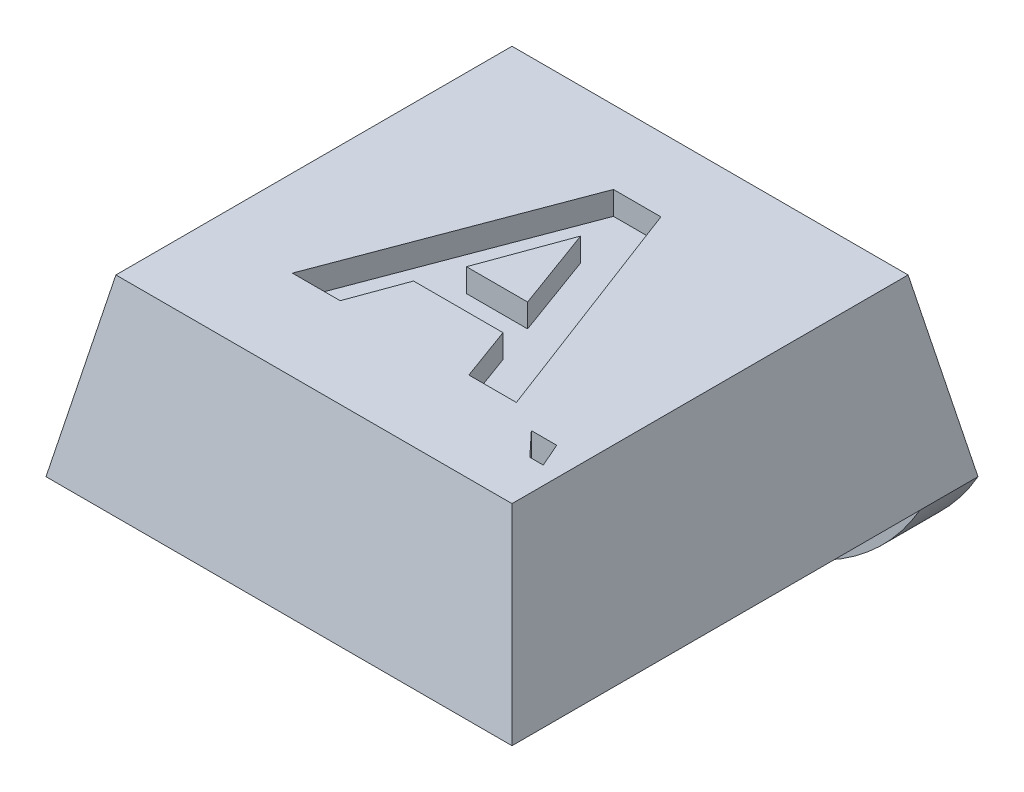
ISO-10303-21;
HEADER;
FILE_DESCRIPTION(('STEP AP214'),'2;1');
FILE_NAME('part.step','',(''),(''),'','','');
FILE_SCHEMA(('AUTOMOTIVE_DESIGN { 1 0 10303 214 1 1 1 1 }'));
ENDSEC;
DATA;
#1=APPLICATION_CONTEXT('core data for automotive mechanical design processes');
#2=APPLICATION_PROTOCOL_DEFINITION('international standard','automotive_design',2000,#1);
#3=PRODUCT_CONTEXT('',#1,'mechanical');
#4=PRODUCT('Part','Part','',(#3));
#5=PRODUCT_RELATED_PRODUCT_CATEGORY('part','',(#4));
#6=PRODUCT_DEFINITION_FORMATION('','',#4);
#7=PRODUCT_DEFINITION_CONTEXT('part definition',#1,'design');
#8=PRODUCT_DEFINITION('design','',#6,#7);
#9=PRODUCT_DEFINITION_SHAPE('','',#8);
#10=(LENGTH_UNIT() NAMED_UNIT(*) SI_UNIT(.MILLI.,.METRE.));
#11=(NAMED_UNIT(*) PLANE_ANGLE_UNIT() SI_UNIT($,.RADIAN.));
#12=(NAMED_UNIT(*) SI_UNIT($,.STERADIAN.) SOLID_ANGLE_UNIT());
#13=UNCERTAINTY_MEASURE_WITH_UNIT(LENGTH_MEASURE(1.E-05),#10,'distance_accuracy_value','');
#14=(GEOMETRIC_REPRESENTATION_CONTEXT(3) GLOBAL_UNCERTAINTY_ASSIGNED_CONTEXT((#13)) GLOBAL_UNIT_ASSIGNED_CONTEXT((#10,
#11,#12)) REPRESENTATION_CONTEXT('',''));
#15=CARTESIAN_POINT('',(0.,0.,0.));
#16=DIRECTION('',(0.,0.,1.));
#17=DIRECTION('',(1.,0.,0.));
#18=AXIS2_PLACEMENT_3D('',#15,#16,#17);
#19=CARTESIAN_POINT('',(0.,3.,0.));
#20=DIRECTION('',(0.,-1.,0.));
#21=DIRECTION('',(0.,0.,-1.));
#22=AXIS2_PLACEMENT_3D('',#19,#20,#21);
#23=PLANE('',#22);
#24=DIRECTION('',(0.355060662326772,0.,0.934843262835045));
#25=VECTOR('',#24,1.);
#26=CARTESIAN_POINT('',(4.41462653323797,3.,-6.14165206843505));
#27=LINE('',#26,#25);
#28=CARTESIAN_POINT('',(4.41462653323797,3.,-6.14165206843505));
#29=VERTEX_POINT('',#28);
#30=CARTESIAN_POINT('',(5.93385730246874,3.,-2.14165206843505));
#31=VERTEX_POINT('',#30);
#32=EDGE_CURVE('E67',#29,#31,#27,.T.);
#33=ORIENTED_EDGE('',*,*,#32,.T.);
#34=DIRECTION('',(-1.,0.,0.));
#35=VECTOR('',#34,1.);
#36=CARTESIAN_POINT('',(5.93385730246874,3.,-2.14165206843505));
#37=LINE('',#36,#35);
#38=CARTESIAN_POINT('',(5.11815217426361,3.,-2.14165206843505));
#39=VERTEX_POINT('',#38);
#40=EDGE_CURVE('E287',#31,#39,#37,.T.);
#41=ORIENTED_EDGE('',*,*,#40,.T.);
#42=DIRECTION('',(-0.343248282132193,0.,-0.939244705501872));
#43=VECTOR('',#42,1.);
#44=CARTESIAN_POINT('',(5.11815217426361,3.,-2.14165206843505));
#45=LINE('',#44,#43);
#46=CARTESIAN_POINT('',(4.78081243067387,3.,-3.06472899151198));
#47=VERTEX_POINT('',#46);
#48=EDGE_CURVE('E291',#39,#47,#45,.T.);
#49=ORIENTED_EDGE('',*,*,#48,.T.);
#50=DIRECTION('',(-1.,0.,0.));
#51=VECTOR('',#50,1.);
#52=CARTESIAN_POINT('',(4.78081243067387,3.,-3.06472899151198));
#53=LINE('',#52,#51);
#54=CARTESIAN_POINT('',(3.24555602041746,3.,-3.06472899151198));
#55=VERTEX_POINT('',#54);
#56=EDGE_CURVE('E295',#47,#55,#53,.T.);
#57=ORIENTED_EDGE('',*,*,#56,.T.);
#58=DIRECTION('',(-0.343248282132194,0.,0.939244705501872));
#59=VECTOR('',#58,1.);
#60=CARTESIAN_POINT('',(3.24555602041746,3.,-3.06472899151198));
#61=LINE('',#60,#59);
#62=CARTESIAN_POINT('',(2.90821627682771,3.,-2.14165206843505));
#63=VERTEX_POINT('',#62);
#64=EDGE_CURVE('E299',#55,#63,#61,.T.);
#65=ORIENTED_EDGE('',*,*,#64,.T.);
#66=DIRECTION('',(-1.,0.,0.));
#67=VECTOR('',#66,1.);
#68=CARTESIAN_POINT('',(2.90821627682771,3.,-2.14165206843505));
#69=LINE('',#68,#67);
#70=CARTESIAN_POINT('',(2.08770345631489,3.,-2.14165206843505));
#71=VERTEX_POINT('',#70);
#72=EDGE_CURVE('E303',#63,#71,#69,.T.);
#73=ORIENTED_EDGE('',*,*,#72,.T.);
#74=DIRECTION('',(0.353586403368764,0.,-0.935401868371419));
#75=VECTOR('',#74,1.);
#76=CARTESIAN_POINT('',(2.08770345631489,3.,-2.14165206843505));
#77=LINE('',#76,#75);
#78=CARTESIAN_POINT('',(3.59972268708412,3.,-6.14165206843505));
#79=VERTEX_POINT('',#78);
#80=EDGE_CURVE('E307',#71,#79,#77,.T.);
#81=ORIENTED_EDGE('',*,*,#80,.T.);
#82=DIRECTION('',(1.,0.,0.));
#83=VECTOR('',#82,1.);
#84=CARTESIAN_POINT('',(3.59972268708412,3.,-6.14165206843505));
#85=LINE('',#84,#83);
#86=EDGE_CURVE('E263',#79,#29,#85,.T.);
#87=ORIENTED_EDGE('',*,*,#86,.T.);
#88=EDGE_LOOP('',(#33,#41,#49,#57,#65,#73,#81,#87));
#89=FACE_BOUND('',#88,.T.);
#90=DIRECTION('',(-1.,0.,0.));
#91=VECTOR('',#90,1.);
#92=CARTESIAN_POINT('',(11.,3.,-0.6));
#93=LINE('',#92,#91);
#94=CARTESIAN_POINT('',(7.4,3.,-0.6));
#95=VERTEX_POINT('',#94);
#96=CARTESIAN_POINT('',(0.6,3.,-0.6));
#97=VERTEX_POINT('',#96);
#98=EDGE_CURVE('E362',#95,#97,#93,.T.);
#99=ORIENTED_EDGE('',*,*,#98,.F.);
#100=DIRECTION('',(0.,0.,1.));
#101=VECTOR('',#100,1.);
#102=CARTESIAN_POINT('',(7.4,3.,-8.));
#103=LINE('',#102,#101);
#104=CARTESIAN_POINT('',(7.4,3.,-7.4));
#105=VERTEX_POINT('',#104);
#106=EDGE_CURVE('E375',#105,#95,#103,.T.);
#107=ORIENTED_EDGE('',*,*,#106,.F.);
#108=DIRECTION('',(-1.,0.,0.));
#109=VECTOR('',#108,1.);
#110=CARTESIAN_POINT('',(11.,3.,-7.4));
#111=LINE('',#110,#109);
#112=CARTESIAN_POINT('',(0.599999999999999,3.,-7.4));
#113=VERTEX_POINT('',#112);
#114=EDGE_CURVE('E358',#105,#113,#111,.T.);
#115=ORIENTED_EDGE('',*,*,#114,.T.);
#116=DIRECTION('',(0.,0.,1.));
#117=VECTOR('',#116,1.);
#118=CARTESIAN_POINT('',(0.6,3.,-8.));
#119=LINE('',#118,#117);
#120=EDGE_CURVE('E378',#113,#97,#119,.T.);
#121=ORIENTED_EDGE('',*,*,#120,.T.);
#122=EDGE_LOOP('',(#99,#107,#115,#121));
#123=FACE_BOUND('',#122,.T.);
#124=DIRECTION('',(0.400818834019709,0.,0.916157334902188));
#125=VECTOR('',#124,1.);
#126=CARTESIAN_POINT('',(6.91610453258598,3.,-1.85152273990893));
#127=LINE('',#126,#125);
#128=CARTESIAN_POINT('',(6.91610453258598,3.,-1.85152273990893));
#129=VERTEX_POINT('',#128);
#130=CARTESIAN_POINT('',(7.09559171207316,3.,-1.44126632965252));
#131=VERTEX_POINT('',#130);
#132=EDGE_CURVE('E59',#129,#131,#127,.T.);
#133=ORIENTED_EDGE('',*,*,#132,.T.);
#134=DIRECTION('',(-1.,0.,0.));
#135=VECTOR('',#134,1.);
#136=CARTESIAN_POINT('',(7.09559171207316,3.,-1.44126632965252));
#137=LINE('',#136,#135);
#138=CARTESIAN_POINT('',(6.86482248130392,3.,-1.44126632965252));
#139=VERTEX_POINT('',#138);
#140=EDGE_CURVE('E215',#131,#139,#137,.T.);
#141=ORIENTED_EDGE('',*,*,#140,.T.);
#142=DIRECTION('',(-0.68394112888133,0.,-0.729537204140085));
#143=VECTOR('',#142,1.);
#144=CARTESIAN_POINT('',(6.86482248130392,3.,-1.44126632965252));
#145=LINE('',#144,#143);
#146=CARTESIAN_POINT('',(6.48020709668854,3.,-1.85152273990893));
#147=VERTEX_POINT('',#146);
#148=EDGE_CURVE('E482',#139,#147,#145,.T.);
#149=ORIENTED_EDGE('',*,*,#148,.T.);
#150=DIRECTION('',(1.,0.,0.));
#151=VECTOR('',#150,1.);
#152=CARTESIAN_POINT('',(6.48020709668854,3.,-1.85152273990893));
#153=LINE('',#152,#151);
#154=EDGE_CURVE('E211',#147,#129,#153,.T.);
#155=ORIENTED_EDGE('',*,*,#154,.T.);
#156=EDGE_LOOP('',(#133,#141,#149,#155));
#157=FACE_BOUND('',#156,.T.);
#158=ADVANCED_FACE('F43',(#89,#123,#157),#23,.F.);
#159=CARTESIAN_POINT('',(8.,0.,-8.));
#160=DIRECTION('',(-0.98058067569092,-0.196116135138184,0.));
#161=DIRECTION('',(0.196116135138184,-0.98058067569092,0.));
#162=AXIS2_PLACEMENT_3D('',#159,#160,#161);
#163=PLANE('',#162);
#164=DIRECTION('',(-0.192450089729875,0.962250448649376,-0.192450089729875));
#165=VECTOR('',#164,1.);
#166=CARTESIAN_POINT('',(7.7037037037037,1.48148148148148,-0.296296296296296));
#167=LINE('',#166,#165);
#168=CARTESIAN_POINT('',(8.,0.,0.));
#169=VERTEX_POINT('',#168);
#170=EDGE_CURVE('E372',#169,#95,#167,.T.);
#171=ORIENTED_EDGE('',*,*,#170,.F.);
#172=DIRECTION('',(0.,0.,-1.));
#173=VECTOR('',#172,1.);
#174=CARTESIAN_POINT('',(8.,0.,0.));
#175=LINE('',#174,#173);
#176=CARTESIAN_POINT('',(8.,0.,-7.));
#177=VERTEX_POINT('',#176);
#178=EDGE_CURVE('E391',#169,#177,#175,.T.);
#179=ORIENTED_EDGE('',*,*,#178,.T.);
#180=DIRECTION('',(0.,0.,1.));
#181=VECTOR('',#180,1.);
#182=CARTESIAN_POINT('',(8.,0.,-8.));
#183=LINE('',#182,#181);
#184=CARTESIAN_POINT('',(8.,0.,-8.));
#185=VERTEX_POINT('',#184);
#186=EDGE_CURVE('E337',#185,#177,#183,.T.);
#187=ORIENTED_EDGE('',*,*,#186,.F.);
#188=DIRECTION('',(0.192450089729875,-0.962250448649376,-0.192450089729875));
#189=VECTOR('',#188,1.);
#190=CARTESIAN_POINT('',(8.,0.,-8.));
#191=LINE('',#190,#189);
#192=EDGE_CURVE('E365',#105,#185,#191,.T.);
#193=ORIENTED_EDGE('',*,*,#192,.F.);
#194=ORIENTED_EDGE('',*,*,#106,.T.);
#195=EDGE_LOOP('',(#171,#179,#187,#193,#194));
#196=FACE_BOUND('',#195,.T.);
#197=ADVANCED_FACE('F464',(#196),#163,.F.);
#198=CARTESIAN_POINT('',(0.,0.,-8.));
#199=DIRECTION('',(0.98058067569092,-0.196116135138184,0.));
#200=DIRECTION('',(0.196116135138184,0.98058067569092,0.));
#201=AXIS2_PLACEMENT_3D('',#198,#199,#200);
#202=PLANE('',#201);
#203=DIRECTION('',(-0.192450089729875,-0.962250448649376,0.192450089729875));
#204=VECTOR('',#203,1.);
#205=CARTESIAN_POINT('',(0.296296296296296,1.48148148148148,-0.296296296296296));
#206=LINE('',#205,#204);
#207=CARTESIAN_POINT('',(0.,0.,0.));
#208=VERTEX_POINT('',#207);
#209=EDGE_CURVE('E419',#97,#208,#206,.T.);
#210=ORIENTED_EDGE('',*,*,#209,.F.);
#211=ORIENTED_EDGE('',*,*,#120,.F.);
#212=DIRECTION('',(0.192450089729875,0.962250448649376,0.192450089729875));
#213=VECTOR('',#212,1.);
#214=CARTESIAN_POINT('',(0.,0.,-8.));
#215=LINE('',#214,#213);
#216=CARTESIAN_POINT('',(0.,0.,-8.));
#217=VERTEX_POINT('',#216);
#218=EDGE_CURVE('E390',#217,#113,#215,.T.);
#219=ORIENTED_EDGE('',*,*,#218,.F.);
#220=DIRECTION('',(0.,0.,1.));
#221=VECTOR('',#220,1.);
#222=CARTESIAN_POINT('',(0.,0.,0.));
#223=LINE('',#222,#221);
#224=CARTESIAN_POINT('',(0.,0.,-7.));
#225=VERTEX_POINT('',#224);
#226=EDGE_CURVE('E395',#217,#225,#223,.T.);
#227=ORIENTED_EDGE('',*,*,#226,.T.);
#228=EDGE_CURVE('E382',#225,#208,#223,.T.);
#229=ORIENTED_EDGE('',*,*,#228,.T.);
#230=EDGE_LOOP('',(#210,#211,#219,#227,#229));
#231=FACE_BOUND('',#230,.T.);
#232=ADVANCED_FACE('F444',(#231),#202,.F.);
#233=CARTESIAN_POINT('',(0.,0.,0.));
#234=DIRECTION('',(0.,-1.,0.));
#235=DIRECTION('',(0.,0.,-1.));
#236=AXIS2_PLACEMENT_3D('',#233,#234,#235);
#237=PLANE('',#236);
#238=DIRECTION('',(-1.,0.,0.));
#239=VECTOR('',#238,1.);
#240=CARTESIAN_POINT('',(0.,0.,-7.));
#241=LINE('',#240,#239);
#242=EDGE_CURVE('E343',#177,#225,#241,.T.);
#243=ORIENTED_EDGE('',*,*,#242,.F.);
#244=ORIENTED_EDGE('',*,*,#178,.F.);
#245=DIRECTION('',(1.,0.,0.));
#246=VECTOR('',#245,1.);
#247=CARTESIAN_POINT('',(0.,0.,0.));
#248=LINE('',#247,#246);
#249=EDGE_CURVE('E392',#208,#169,#248,.T.);
#250=ORIENTED_EDGE('',*,*,#249,.F.);
#251=ORIENTED_EDGE('',*,*,#228,.F.);
#252=EDGE_LOOP('',(#243,#244,#250,#251));
#253=FACE_BOUND('',#252,.T.);
#254=CARTESIAN_POINT('',(4.,0.,-3.75));
#255=DIRECTION('',(0.,-1.,0.));
#256=DIRECTION('',(0.,0.,-1.));
#257=AXIS2_PLACEMENT_3D('',#254,#255,#256);
#258=CIRCLE('',#257,1.75);
#259=CARTESIAN_POINT('',(4.,0.,-5.5));
#260=VERTEX_POINT('',#259);
#261=EDGE_CURVE('E347',#260,#260,#258,.T.);
#262=ORIENTED_EDGE('',*,*,#261,.F.);
#263=EDGE_LOOP('',(#262));
#264=FACE_BOUND('',#263,.T.);
#265=ADVANCED_FACE('F459',(#253,#264),#237,.T.);
#266=CARTESIAN_POINT('',(11.,3.,-7.4));
#267=DIRECTION('',(0.,0.196116135138184,-0.98058067569092));
#268=DIRECTION('',(0.,0.98058067569092,0.196116135138184));
#269=AXIS2_PLACEMENT_3D('',#266,#267,#268);
#270=PLANE('',#269);
#271=ORIENTED_EDGE('',*,*,#192,.T.);
#272=DIRECTION('',(-1.,0.,0.));
#273=VECTOR('',#272,1.);
#274=CARTESIAN_POINT('',(0.,0.,-8.));
#275=LINE('',#274,#273);
#276=EDGE_CURVE('E386',#185,#217,#275,.T.);
#277=ORIENTED_EDGE('',*,*,#276,.T.);
#278=ORIENTED_EDGE('',*,*,#218,.T.);
#279=ORIENTED_EDGE('',*,*,#114,.F.);
#280=EDGE_LOOP('',(#271,#277,#278,#279));
#281=FACE_BOUND('',#280,.T.);
#282=ADVANCED_FACE('F439',(#281),#270,.T.);
#283=CARTESIAN_POINT('',(11.,0.,0.));
#284=DIRECTION('',(0.,0.196116135138184,0.98058067569092));
#285=DIRECTION('',(0.,-0.98058067569092,0.196116135138184));
#286=AXIS2_PLACEMENT_3D('',#283,#284,#285);
#287=PLANE('',#286);
#288=ORIENTED_EDGE('',*,*,#170,.T.);
#289=ORIENTED_EDGE('',*,*,#98,.T.);
#290=ORIENTED_EDGE('',*,*,#209,.T.);
#291=ORIENTED_EDGE('',*,*,#249,.T.);
#292=EDGE_LOOP('',(#288,#289,#290,#291));
#293=FACE_BOUND('',#292,.T.);
#294=ADVANCED_FACE('F468',(#293),#287,.T.);
#295=CARTESIAN_POINT('',(4.,0.4,-3.75));
#296=DIRECTION('',(0.,-1.,0.));
#297=DIRECTION('',(0.,0.,-1.));
#298=AXIS2_PLACEMENT_3D('',#295,#296,#297);
#299=CYLINDRICAL_SURFACE('',#298,1.75);
#300=CARTESIAN_POINT('',(4.,0.4,-3.75));
#301=DIRECTION('',(0.,-1.,0.));
#302=DIRECTION('',(0.,0.,-1.));
#303=AXIS2_PLACEMENT_3D('',#300,#301,#302);
#304=CIRCLE('',#303,1.75);
#305=CARTESIAN_POINT('',(4.,0.4,-5.5));
#306=VERTEX_POINT('',#305);
#307=EDGE_CURVE('E354',#306,#306,#304,.T.);
#308=ORIENTED_EDGE('',*,*,#307,.F.);
#309=EDGE_LOOP('',(#308));
#310=FACE_BOUND('',#309,.T.);
#311=ORIENTED_EDGE('',*,*,#261,.T.);
#312=EDGE_LOOP('',(#311));
#313=FACE_BOUND('',#312,.T.);
#314=ADVANCED_FACE('F571',(#310,#313),#299,.F.);
#315=CARTESIAN_POINT('',(4.,0.4,-3.75));
#316=DIRECTION('',(0.,-1.,0.));
#317=DIRECTION('',(0.,0.,-1.));
#318=AXIS2_PLACEMENT_3D('',#315,#316,#317);
#319=PLANE('',#318);
#320=ORIENTED_EDGE('',*,*,#307,.T.);
#321=EDGE_LOOP('',(#320));
#322=FACE_BOUND('',#321,.T.);
#323=ADVANCED_FACE('F568',(#322),#319,.T.);
#324=CARTESIAN_POINT('',(0.,-2.,-8.));
#325=DIRECTION('',(0.,0.,1.));
#326=DIRECTION('',(1.,0.,0.));
#327=AXIS2_PLACEMENT_3D('',#324,#325,#326);
#328=PLANE('',#327);
#329=ORIENTED_EDGE('',*,*,#276,.F.);
#330=CARTESIAN_POINT('',(4.53589838486225,2.,-8.));
#331=DIRECTION('',(0.,0.,1.));
#332=DIRECTION('',(1.,0.,0.));
#333=AXIS2_PLACEMENT_3D('',#330,#331,#332);
#334=CIRCLE('',#333,4.);
#335=CARTESIAN_POINT('',(4.53589838486225,-2.,-8.));
#336=VERTEX_POINT('',#335);
#337=EDGE_CURVE('E11',#185,#336,#334,.F.);
#338=ORIENTED_EDGE('',*,*,#337,.T.);
#339=DIRECTION('',(1.,0.,0.));
#340=VECTOR('',#339,1.);
#341=CARTESIAN_POINT('',(0.,-2.,-8.));
#342=LINE('',#341,#340);
#343=CARTESIAN_POINT('',(3.46410161513775,-2.,-8.));
#344=VERTEX_POINT('',#343);
#345=EDGE_CURVE('E338',#344,#336,#342,.T.);
#346=ORIENTED_EDGE('',*,*,#345,.F.);
#347=CARTESIAN_POINT('',(3.46410161513775,2.,-8.));
#348=DIRECTION('',(0.,0.,1.));
#349=DIRECTION('',(1.,0.,0.));
#350=AXIS2_PLACEMENT_3D('',#347,#348,#349);
#351=CIRCLE('',#350,4.);
#352=EDGE_CURVE('E52',#344,#217,#351,.F.);
#353=ORIENTED_EDGE('',*,*,#352,.T.);
#354=EDGE_LOOP('',(#329,#338,#346,#353));
#355=FACE_BOUND('',#354,.T.);
#356=ADVANCED_FACE('F432',(#355),#328,.F.);
#357=CARTESIAN_POINT('',(0.,-2.,-7.));
#358=DIRECTION('',(0.,0.,-1.));
#359=DIRECTION('',(-1.,0.,0.));
#360=AXIS2_PLACEMENT_3D('',#357,#358,#359);
#361=PLANE('',#360);
#362=DIRECTION('',(-1.,0.,0.));
#363=VECTOR('',#362,1.);
#364=CARTESIAN_POINT('',(0.,-2.,-7.));
#365=LINE('',#364,#363);
#366=CARTESIAN_POINT('',(4.53589838486225,-2.,-7.));
#367=VERTEX_POINT('',#366);
#368=CARTESIAN_POINT('',(3.46410161513775,-2.,-7.));
#369=VERTEX_POINT('',#368);
#370=EDGE_CURVE('E342',#367,#369,#365,.T.);
#371=ORIENTED_EDGE('',*,*,#370,.F.);
#372=CARTESIAN_POINT('',(4.53589838486225,2.,-7.));
#373=DIRECTION('',(0.,0.,-1.));
#374=DIRECTION('',(-1.,0.,0.));
#375=AXIS2_PLACEMENT_3D('',#372,#373,#374);
#376=CIRCLE('',#375,4.);
#377=EDGE_CURVE('E426',#367,#177,#376,.F.);
#378=ORIENTED_EDGE('',*,*,#377,.T.);
#379=ORIENTED_EDGE('',*,*,#242,.T.);
#380=CARTESIAN_POINT('',(3.46410161513775,2.,-7.));
#381=DIRECTION('',(0.,0.,-1.));
#382=DIRECTION('',(-1.,0.,0.));
#383=AXIS2_PLACEMENT_3D('',#380,#381,#382);
#384=CIRCLE('',#383,4.);
#385=EDGE_CURVE('E423',#225,#369,#384,.F.);
#386=ORIENTED_EDGE('',*,*,#385,.T.);
#387=EDGE_LOOP('',(#371,#378,#379,#386));
#388=FACE_BOUND('',#387,.T.);
#389=ADVANCED_FACE('F450',(#388),#361,.F.);
#390=CARTESIAN_POINT('',(0.,-2.,0.));
#391=DIRECTION('',(0.,1.,0.));
#392=DIRECTION('',(0.,0.,1.));
#393=AXIS2_PLACEMENT_3D('',#390,#391,#392);
#394=PLANE('',#393);
#395=ORIENTED_EDGE('',*,*,#345,.T.);
#396=DIRECTION('',(0.,0.,1.));
#397=VECTOR('',#396,1.);
#398=CARTESIAN_POINT('',(4.53589838486225,-2.,0.));
#399=LINE('',#398,#397);
#400=EDGE_CURVE('E418',#336,#367,#399,.T.);
#401=ORIENTED_EDGE('',*,*,#400,.T.);
#402=ORIENTED_EDGE('',*,*,#370,.T.);
#403=DIRECTION('',(0.,0.,-1.));
#404=VECTOR('',#403,1.);
#405=CARTESIAN_POINT('',(3.46410161513775,-2.,0.));
#406=LINE('',#405,#404);
#407=EDGE_CURVE('E414',#369,#344,#406,.T.);
#408=ORIENTED_EDGE('',*,*,#407,.T.);
#409=EDGE_LOOP('',(#395,#401,#402,#408));
#410=FACE_BOUND('',#409,.T.);
#411=ADVANCED_FACE('F453',(#410),#394,.F.);
#412=CARTESIAN_POINT('',(4.53589838486225,2.,-8.));
#413=DIRECTION('',(0.,0.,1.));
#414=DIRECTION('',(1.,0.,0.));
#415=AXIS2_PLACEMENT_3D('',#412,#413,#414);
#416=CYLINDRICAL_SURFACE('',#415,4.);
#417=ORIENTED_EDGE('',*,*,#337,.F.);
#418=ORIENTED_EDGE('',*,*,#186,.T.);
#419=ORIENTED_EDGE('',*,*,#377,.F.);
#420=ORIENTED_EDGE('',*,*,#400,.F.);
#421=EDGE_LOOP('',(#417,#418,#419,#420));
#422=FACE_BOUND('',#421,.T.);
#423=ADVANCED_FACE('F456',(#422),#416,.T.);
#424=CARTESIAN_POINT('',(3.46410161513775,2.,-8.));
#425=DIRECTION('',(0.,0.,-1.));
#426=DIRECTION('',(-1.,0.,0.));
#427=AXIS2_PLACEMENT_3D('',#424,#425,#426);
#428=CYLINDRICAL_SURFACE('',#427,4.);
#429=ORIENTED_EDGE('',*,*,#385,.F.);
#430=ORIENTED_EDGE('',*,*,#226,.F.);
#431=ORIENTED_EDGE('',*,*,#352,.F.);
#432=ORIENTED_EDGE('',*,*,#407,.F.);
#433=EDGE_LOOP('',(#429,#430,#431,#432));
#434=FACE_BOUND('',#433,.T.);
#435=ADVANCED_FACE('F45',(#434),#428,.T.);
#436=CARTESIAN_POINT('',(4.41462653323797,2.6,-6.14165206843505));
#437=DIRECTION('',(-0.934843262835046,0.,0.355060662326772));
#438=DIRECTION('',(0.355060662326772,0.,0.934843262835046));
#439=AXIS2_PLACEMENT_3D('',#436,#437,#438);
#440=PLANE('',#439);
#441=ORIENTED_EDGE('',*,*,#32,.F.);
#442=DIRECTION('',(0.,1.,0.));
#443=VECTOR('',#442,1.);
#444=CARTESIAN_POINT('',(4.41462653323797,2.6,-6.14165206843505));
#445=LINE('',#444,#443);
#446=CARTESIAN_POINT('',(4.41462653323797,2.6,-6.14165206843505));
#447=VERTEX_POINT('',#446);
#448=EDGE_CURVE('E284',#447,#29,#445,.T.);
#449=ORIENTED_EDGE('',*,*,#448,.F.);
#450=DIRECTION('',(0.355060662326772,0.,0.934843262835045));
#451=VECTOR('',#450,1.);
#452=CARTESIAN_POINT('',(4.41462653323797,2.6,-6.14165206843505));
#453=LINE('',#452,#451);
#454=CARTESIAN_POINT('',(5.93385730246874,2.6,-2.14165206843505));
#455=VERTEX_POINT('',#454);
#456=EDGE_CURVE('E258',#447,#455,#453,.T.);
#457=ORIENTED_EDGE('',*,*,#456,.T.);
#458=DIRECTION('',(0.,1.,0.));
#459=VECTOR('',#458,1.);
#460=CARTESIAN_POINT('',(5.93385730246874,2.6,-2.14165206843505));
#461=LINE('',#460,#459);
#462=EDGE_CURVE('E334',#455,#31,#461,.T.);
#463=ORIENTED_EDGE('',*,*,#462,.T.);
#464=EDGE_LOOP('',(#441,#449,#457,#463));
#465=FACE_BOUND('',#464,.T.);
#466=ADVANCED_FACE('F558',(#465),#440,.T.);
#467=CARTESIAN_POINT('',(5.93385730246874,2.6,-2.14165206843505));
#468=DIRECTION('',(0.,0.,-1.));
#469=DIRECTION('',(-1.,0.,0.));
#470=AXIS2_PLACEMENT_3D('',#467,#468,#469);
#471=PLANE('',#470);
#472=ORIENTED_EDGE('',*,*,#40,.F.);
#473=ORIENTED_EDGE('',*,*,#462,.F.);
#474=DIRECTION('',(-1.,0.,0.));
#475=VECTOR('',#474,1.);
#476=CARTESIAN_POINT('',(5.93385730246874,2.6,-2.14165206843505));
#477=LINE('',#476,#475);
#478=CARTESIAN_POINT('',(5.11815217426361,2.6,-2.14165206843505));
#479=VERTEX_POINT('',#478);
#480=EDGE_CURVE('E262',#455,#479,#477,.T.);
#481=ORIENTED_EDGE('',*,*,#480,.T.);
#482=DIRECTION('',(0.,1.,0.));
#483=VECTOR('',#482,1.);
#484=CARTESIAN_POINT('',(5.11815217426361,2.6,-2.14165206843505));
#485=LINE('',#484,#483);
#486=EDGE_CURVE('E331',#479,#39,#485,.T.);
#487=ORIENTED_EDGE('',*,*,#486,.T.);
#488=EDGE_LOOP('',(#472,#473,#481,#487));
#489=FACE_BOUND('',#488,.T.);
#490=ADVANCED_FACE('F554',(#489),#471,.T.);
#491=CARTESIAN_POINT('',(5.11815217426361,2.6,-2.14165206843505));
#492=DIRECTION('',(0.939244705501872,0.,-0.343248282132193));
#493=DIRECTION('',(-0.343248282132193,0.,-0.939244705501872));
#494=AXIS2_PLACEMENT_3D('',#491,#492,#493);
#495=PLANE('',#494);
#496=ORIENTED_EDGE('',*,*,#48,.F.);
#497=ORIENTED_EDGE('',*,*,#486,.F.);
#498=DIRECTION('',(-0.343248282132193,0.,-0.939244705501872));
#499=VECTOR('',#498,1.);
#500=CARTESIAN_POINT('',(5.11815217426361,2.6,-2.14165206843505));
#501=LINE('',#500,#499);
#502=CARTESIAN_POINT('',(4.78081243067387,2.6,-3.06472899151198));
#503=VERTEX_POINT('',#502);
#504=EDGE_CURVE('E266',#479,#503,#501,.T.);
#505=ORIENTED_EDGE('',*,*,#504,.T.);
#506=DIRECTION('',(0.,1.,0.));
#507=VECTOR('',#506,1.);
#508=CARTESIAN_POINT('',(4.78081243067387,2.6,-3.06472899151198));
#509=LINE('',#508,#507);
#510=EDGE_CURVE('E328',#503,#47,#509,.T.);
#511=ORIENTED_EDGE('',*,*,#510,.T.);
#512=EDGE_LOOP('',(#496,#497,#505,#511));
#513=FACE_BOUND('',#512,.T.);
#514=ADVANCED_FACE('F550',(#513),#495,.T.);
#515=CARTESIAN_POINT('',(4.78081243067387,2.6,-3.06472899151198));
#516=DIRECTION('',(0.,0.,-1.));
#517=DIRECTION('',(-1.,0.,0.));
#518=AXIS2_PLACEMENT_3D('',#515,#516,#517);
#519=PLANE('',#518);
#520=ORIENTED_EDGE('',*,*,#56,.F.);
#521=ORIENTED_EDGE('',*,*,#510,.F.);
#522=DIRECTION('',(-1.,0.,0.));
#523=VECTOR('',#522,1.);
#524=CARTESIAN_POINT('',(4.78081243067387,2.6,-3.06472899151198));
#525=LINE('',#524,#523);
#526=CARTESIAN_POINT('',(3.24555602041746,2.6,-3.06472899151198));
#527=VERTEX_POINT('',#526);
#528=EDGE_CURVE('E269',#503,#527,#525,.T.);
#529=ORIENTED_EDGE('',*,*,#528,.T.);
#530=DIRECTION('',(0.,1.,0.));
#531=VECTOR('',#530,1.);
#532=CARTESIAN_POINT('',(3.24555602041746,2.6,-3.06472899151198));
#533=LINE('',#532,#531);
#534=EDGE_CURVE('E325',#527,#55,#533,.T.);
#535=ORIENTED_EDGE('',*,*,#534,.T.);
#536=EDGE_LOOP('',(#520,#521,#529,#535));
#537=FACE_BOUND('',#536,.T.);
#538=ADVANCED_FACE('F546',(#537),#519,.T.);
#539=CARTESIAN_POINT('',(3.24555602041746,2.6,-3.06472899151198));
#540=DIRECTION('',(-0.939244705501871,0.,-0.343248282132194));
#541=DIRECTION('',(-0.343248282132194,0.,0.939244705501872));
#542=AXIS2_PLACEMENT_3D('',#539,#540,#541);
#543=PLANE('',#542);
#544=ORIENTED_EDGE('',*,*,#64,.F.);
#545=ORIENTED_EDGE('',*,*,#534,.F.);
#546=DIRECTION('',(-0.343248282132194,0.,0.939244705501872));
#547=VECTOR('',#546,1.);
#548=CARTESIAN_POINT('',(3.24555602041746,2.6,-3.06472899151198));
#549=LINE('',#548,#547);
#550=CARTESIAN_POINT('',(2.90821627682771,2.6,-2.14165206843505));
#551=VERTEX_POINT('',#550);
#552=EDGE_CURVE('E272',#527,#551,#549,.T.);
#553=ORIENTED_EDGE('',*,*,#552,.T.);
#554=DIRECTION('',(0.,1.,0.));
#555=VECTOR('',#554,1.);
#556=CARTESIAN_POINT('',(2.90821627682771,2.6,-2.14165206843505));
#557=LINE('',#556,#555);
#558=EDGE_CURVE('E322',#551,#63,#557,.T.);
#559=ORIENTED_EDGE('',*,*,#558,.T.);
#560=EDGE_LOOP('',(#544,#545,#553,#559));
#561=FACE_BOUND('',#560,.T.);
#562=ADVANCED_FACE('F542',(#561),#543,.T.);
#563=CARTESIAN_POINT('',(2.90821627682771,2.6,-2.14165206843505));
#564=DIRECTION('',(0.,0.,-1.));
#565=DIRECTION('',(-1.,0.,0.));
#566=AXIS2_PLACEMENT_3D('',#563,#564,#565);
#567=PLANE('',#566);
#568=ORIENTED_EDGE('',*,*,#72,.F.);
#569=ORIENTED_EDGE('',*,*,#558,.F.);
#570=DIRECTION('',(-1.,0.,0.));
#571=VECTOR('',#570,1.);
#572=CARTESIAN_POINT('',(2.90821627682771,2.6,-2.14165206843505));
#573=LINE('',#572,#571);
#574=CARTESIAN_POINT('',(2.08770345631489,2.6,-2.14165206843505));
#575=VERTEX_POINT('',#574);
#576=EDGE_CURVE('E275',#551,#575,#573,.T.);
#577=ORIENTED_EDGE('',*,*,#576,.T.);
#578=DIRECTION('',(0.,1.,0.));
#579=VECTOR('',#578,1.);
#580=CARTESIAN_POINT('',(2.08770345631489,2.6,-2.14165206843505));
#581=LINE('',#580,#579);
#582=EDGE_CURVE('E319',#575,#71,#581,.T.);
#583=ORIENTED_EDGE('',*,*,#582,.T.);
#584=EDGE_LOOP('',(#568,#569,#577,#583));
#585=FACE_BOUND('',#584,.T.);
#586=ADVANCED_FACE('F538',(#585),#567,.T.);
#587=CARTESIAN_POINT('',(2.08770345631489,2.6,-2.14165206843505));
#588=DIRECTION('',(0.935401868371419,0.,0.353586403368764));
#589=DIRECTION('',(0.353586403368764,0.,-0.935401868371419));
#590=AXIS2_PLACEMENT_3D('',#587,#588,#589);
#591=PLANE('',#590);
#592=ORIENTED_EDGE('',*,*,#80,.F.);
#593=ORIENTED_EDGE('',*,*,#582,.F.);
#594=DIRECTION('',(0.353586403368764,0.,-0.935401868371419));
#595=VECTOR('',#594,1.);
#596=CARTESIAN_POINT('',(2.08770345631489,2.6,-2.14165206843505));
#597=LINE('',#596,#595);
#598=CARTESIAN_POINT('',(3.59972268708412,2.6,-6.14165206843505));
#599=VERTEX_POINT('',#598);
#600=EDGE_CURVE('E278',#575,#599,#597,.T.);
#601=ORIENTED_EDGE('',*,*,#600,.T.);
#602=DIRECTION('',(0.,1.,0.));
#603=VECTOR('',#602,1.);
#604=CARTESIAN_POINT('',(3.59972268708412,2.6,-6.14165206843505));
#605=LINE('',#604,#603);
#606=EDGE_CURVE('E316',#599,#79,#605,.T.);
#607=ORIENTED_EDGE('',*,*,#606,.T.);
#608=EDGE_LOOP('',(#592,#593,#601,#607));
#609=FACE_BOUND('',#608,.T.);
#610=ADVANCED_FACE('F534',(#609),#591,.T.);
#611=CARTESIAN_POINT('',(3.59972268708412,2.6,-6.14165206843505));
#612=DIRECTION('',(0.,0.,1.));
#613=DIRECTION('',(1.,0.,0.));
#614=AXIS2_PLACEMENT_3D('',#611,#612,#613);
#615=PLANE('',#614);
#616=ORIENTED_EDGE('',*,*,#86,.F.);
#617=ORIENTED_EDGE('',*,*,#606,.F.);
#618=DIRECTION('',(1.,0.,0.));
#619=VECTOR('',#618,1.);
#620=CARTESIAN_POINT('',(3.59972268708412,2.6,-6.14165206843505));
#621=LINE('',#620,#619);
#622=EDGE_CURVE('E281',#599,#447,#621,.T.);
#623=ORIENTED_EDGE('',*,*,#622,.T.);
#624=ORIENTED_EDGE('',*,*,#448,.T.);
#625=EDGE_LOOP('',(#616,#617,#623,#624));
#626=FACE_BOUND('',#625,.T.);
#627=ADVANCED_FACE('F530',(#626),#615,.T.);
#628=CARTESIAN_POINT('',(0.,2.6,0.));
#629=DIRECTION('',(0.,-1.,0.));
#630=DIRECTION('',(0.,0.,-1.));
#631=AXIS2_PLACEMENT_3D('',#628,#629,#630);
#632=PLANE('',#631);
#633=DIRECTION('',(1.,0.,0.));
#634=VECTOR('',#633,1.);
#635=CARTESIAN_POINT('',(3.48674191785335,2.6,-3.73139565817864));
#636=LINE('',#635,#634);
#637=CARTESIAN_POINT('',(3.48674191785335,2.6,-3.73139565817864));
#638=VERTEX_POINT('',#637);
#639=CARTESIAN_POINT('',(4.53642140503284,2.6,-3.73139565817864));
#640=VERTEX_POINT('',#639);
#641=EDGE_CURVE('E229',#638,#640,#636,.T.);
#642=ORIENTED_EDGE('',*,*,#641,.F.);
#643=DIRECTION('',(-0.342837179853215,0.,0.939394841432661));
#644=VECTOR('',#643,1.);
#645=CARTESIAN_POINT('',(4.01078037939182,2.6,-5.16729309407608));
#646=LINE('',#645,#644);
#647=CARTESIAN_POINT('',(4.01078037939182,2.6,-5.16729309407608));
#648=VERTEX_POINT('',#647);
#649=EDGE_CURVE('E238',#648,#638,#646,.T.);
#650=ORIENTED_EDGE('',*,*,#649,.F.);
#651=DIRECTION('',(-0.343761882683262,0.,-0.939056850256713));
#652=VECTOR('',#651,1.);
#653=CARTESIAN_POINT('',(4.53642140503284,2.6,-3.73139565817864));
#654=LINE('',#653,#652);
#655=EDGE_CURVE('E233',#640,#648,#654,.T.);
#656=ORIENTED_EDGE('',*,*,#655,.F.);
#657=EDGE_LOOP('',(#642,#650,#656));
#658=FACE_BOUND('',#657,.T.);
#659=ORIENTED_EDGE('',*,*,#456,.F.);
#660=ORIENTED_EDGE('',*,*,#622,.F.);
#661=ORIENTED_EDGE('',*,*,#600,.F.);
#662=ORIENTED_EDGE('',*,*,#576,.F.);
#663=ORIENTED_EDGE('',*,*,#552,.F.);
#664=ORIENTED_EDGE('',*,*,#528,.F.);
#665=ORIENTED_EDGE('',*,*,#504,.F.);
#666=ORIENTED_EDGE('',*,*,#480,.F.);
#667=EDGE_LOOP('',(#659,#660,#661,#662,#663,#664,#665,#666));
#668=FACE_BOUND('',#667,.T.);
#669=ADVANCED_FACE('F526',(#658,#668),#632,.F.);
#670=CARTESIAN_POINT('',(3.48674191785335,2.6,-3.73139565817864));
#671=DIRECTION('',(0.,0.,1.));
#672=DIRECTION('',(1.,0.,0.));
#673=AXIS2_PLACEMENT_3D('',#670,#671,#672);
#674=PLANE('',#673);
#675=DIRECTION('',(1.,0.,0.));
#676=VECTOR('',#675,1.);
#677=CARTESIAN_POINT('',(3.48674191785335,3.,-3.73139565817864));
#678=LINE('',#677,#676);
#679=CARTESIAN_POINT('',(3.48674191785335,3.,-3.73139565817864));
#680=VERTEX_POINT('',#679);
#681=CARTESIAN_POINT('',(4.53642140503284,3.,-3.73139565817864));
#682=VERTEX_POINT('',#681);
#683=EDGE_CURVE('E217',#680,#682,#678,.T.);
#684=ORIENTED_EDGE('',*,*,#683,.F.);
#685=DIRECTION('',(0.,1.,0.));
#686=VECTOR('',#685,1.);
#687=CARTESIAN_POINT('',(3.48674191785335,2.6,-3.73139565817864));
#688=LINE('',#687,#686);
#689=EDGE_CURVE('E249',#638,#680,#688,.T.);
#690=ORIENTED_EDGE('',*,*,#689,.F.);
#691=ORIENTED_EDGE('',*,*,#641,.T.);
#692=DIRECTION('',(0.,1.,0.));
#693=VECTOR('',#692,1.);
#694=CARTESIAN_POINT('',(4.53642140503284,2.6,-3.73139565817864));
#695=LINE('',#694,#693);
#696=EDGE_CURVE('E241',#640,#682,#695,.T.);
#697=ORIENTED_EDGE('',*,*,#696,.T.);
#698=EDGE_LOOP('',(#684,#690,#691,#697));
#699=FACE_BOUND('',#698,.T.);
#700=ADVANCED_FACE('F519',(#699),#674,.T.);
#701=CARTESIAN_POINT('',(4.01078037939182,2.6,-5.16729309407608));
#702=DIRECTION('',(-0.939394841432661,0.,-0.342837179853215));
#703=DIRECTION('',(-0.342837179853215,0.,0.939394841432661));
#704=AXIS2_PLACEMENT_3D('',#701,#702,#703);
#705=PLANE('',#704);
#706=DIRECTION('',(-0.342837179853215,0.,0.939394841432661));
#707=VECTOR('',#706,1.);
#708=CARTESIAN_POINT('',(4.01078037939182,3.,-5.16729309407608));
#709=LINE('',#708,#707);
#710=CARTESIAN_POINT('',(4.01078037939182,3.,-5.16729309407608));
#711=VERTEX_POINT('',#710);
#712=EDGE_CURVE('E234',#711,#680,#709,.T.);
#713=ORIENTED_EDGE('',*,*,#712,.F.);
#714=DIRECTION('',(0.,1.,0.));
#715=VECTOR('',#714,1.);
#716=CARTESIAN_POINT('',(4.01078037939182,2.6,-5.16729309407608));
#717=LINE('',#716,#715);
#718=EDGE_CURVE('E252',#648,#711,#717,.T.);
#719=ORIENTED_EDGE('',*,*,#718,.F.);
#720=ORIENTED_EDGE('',*,*,#649,.T.);
#721=ORIENTED_EDGE('',*,*,#689,.T.);
#722=EDGE_LOOP('',(#713,#719,#720,#721));
#723=FACE_BOUND('',#722,.T.);
#724=ADVANCED_FACE('F515',(#723),#705,.T.);
#725=CARTESIAN_POINT('',(4.53642140503284,2.6,-3.73139565817864));
#726=DIRECTION('',(0.939056850256713,0.,-0.343761882683262));
#727=DIRECTION('',(-0.343761882683262,0.,-0.939056850256713));
#728=AXIS2_PLACEMENT_3D('',#725,#726,#727);
#729=PLANE('',#728);
#730=DIRECTION('',(-0.343761882683262,0.,-0.939056850256713));
#731=VECTOR('',#730,1.);
#732=CARTESIAN_POINT('',(4.53642140503284,3.,-3.73139565817864));
#733=LINE('',#732,#731);
#734=EDGE_CURVE('E223',#682,#711,#733,.T.);
#735=ORIENTED_EDGE('',*,*,#734,.F.);
#736=ORIENTED_EDGE('',*,*,#696,.F.);
#737=ORIENTED_EDGE('',*,*,#655,.T.);
#738=ORIENTED_EDGE('',*,*,#718,.T.);
#739=EDGE_LOOP('',(#735,#736,#737,#738));
#740=FACE_BOUND('',#739,.T.);
#741=ADVANCED_FACE('F518',(#740),#729,.T.);
#742=ORIENTED_EDGE('',*,*,#683,.T.);
#743=ORIENTED_EDGE('',*,*,#734,.T.);
#744=ORIENTED_EDGE('',*,*,#712,.T.);
#745=EDGE_LOOP('',(#742,#743,#744));
#746=FACE_BOUND('',#745,.T.);
#747=ADVANCED_FACE('F475',(#746),#23,.F.);
#748=CARTESIAN_POINT('',(6.91610453258598,2.5,-1.85152273990893));
#749=DIRECTION('',(-0.916157334902188,0.,0.400818834019709));
#750=DIRECTION('',(0.400818834019709,0.,0.916157334902189));
#751=AXIS2_PLACEMENT_3D('',#748,#749,#750);
#752=PLANE('',#751);
#753=ORIENTED_EDGE('',*,*,#132,.F.);
#754=DIRECTION('',(0.,1.,0.));
#755=VECTOR('',#754,1.);
#756=CARTESIAN_POINT('',(6.91610453258598,2.5,-1.85152273990893));
#757=LINE('',#756,#755);
#758=CARTESIAN_POINT('',(6.91610453258598,2.5,-1.85152273990893));
#759=VERTEX_POINT('',#758);
#760=EDGE_CURVE('E209',#759,#129,#757,.T.);
#761=ORIENTED_EDGE('',*,*,#760,.F.);
#762=DIRECTION('',(0.400818834019709,0.,0.916157334902188));
#763=VECTOR('',#762,1.);
#764=CARTESIAN_POINT('',(6.91610453258598,2.5,-1.85152273990893));
#765=LINE('',#764,#763);
#766=CARTESIAN_POINT('',(7.09559171207316,2.5,-1.44126632965252));
#767=VERTEX_POINT('',#766);
#768=EDGE_CURVE('E200',#759,#767,#765,.T.);
#769=ORIENTED_EDGE('',*,*,#768,.T.);
#770=DIRECTION('',(0.,1.,0.));
#771=VECTOR('',#770,1.);
#772=CARTESIAN_POINT('',(7.09559171207316,2.5,-1.44126632965252));
#773=LINE('',#772,#771);
#774=EDGE_CURVE('E208',#767,#131,#773,.T.);
#775=ORIENTED_EDGE('',*,*,#774,.T.);
#776=EDGE_LOOP('',(#753,#761,#769,#775));
#777=FACE_BOUND('',#776,.T.);
#778=ADVANCED_FACE('F207',(#777),#752,.T.);
#779=CARTESIAN_POINT('',(7.09559171207316,2.5,-1.44126632965252));
#780=DIRECTION('',(0.,0.,-1.));
#781=DIRECTION('',(-1.,0.,0.));
#782=AXIS2_PLACEMENT_3D('',#779,#780,#781);
#783=PLANE('',#782);
#784=ORIENTED_EDGE('',*,*,#140,.F.);
#785=ORIENTED_EDGE('',*,*,#774,.F.);
#786=DIRECTION('',(-1.,0.,0.));
#787=VECTOR('',#786,1.);
#788=CARTESIAN_POINT('',(7.09559171207316,2.5,-1.44126632965252));
#789=LINE('',#788,#787);
#790=CARTESIAN_POINT('',(6.86482248130392,2.5,-1.44126632965252));
#791=VERTEX_POINT('',#790);
#792=EDGE_CURVE('E196',#767,#791,#789,.T.);
#793=ORIENTED_EDGE('',*,*,#792,.T.);
#794=DIRECTION('',(0.,1.,0.));
#795=VECTOR('',#794,1.);
#796=CARTESIAN_POINT('',(6.86482248130392,2.5,-1.44126632965252));
#797=LINE('',#796,#795);
#798=EDGE_CURVE('E218',#791,#139,#797,.T.);
#799=ORIENTED_EDGE('',*,*,#798,.T.);
#800=EDGE_LOOP('',(#784,#785,#793,#799));
#801=FACE_BOUND('',#800,.T.);
#802=ADVANCED_FACE('F213',(#801),#783,.T.);
#803=CARTESIAN_POINT('',(6.86482248130392,2.5,-1.44126632965252));
#804=DIRECTION('',(0.729537204140085,0.,-0.68394112888133));
#805=DIRECTION('',(-0.68394112888133,0.,-0.729537204140085));
#806=AXIS2_PLACEMENT_3D('',#803,#804,#805);
#807=PLANE('',#806);
#808=ORIENTED_EDGE('',*,*,#148,.F.);
#809=ORIENTED_EDGE('',*,*,#798,.F.);
#810=DIRECTION('',(-0.68394112888133,0.,-0.729537204140085));
#811=VECTOR('',#810,1.);
#812=CARTESIAN_POINT('',(6.86482248130392,2.5,-1.44126632965252));
#813=LINE('',#812,#811);
#814=CARTESIAN_POINT('',(6.48020709668854,2.5,-1.85152273990893));
#815=VERTEX_POINT('',#814);
#816=EDGE_CURVE('E201',#791,#815,#813,.T.);
#817=ORIENTED_EDGE('',*,*,#816,.T.);
#818=DIRECTION('',(0.,1.,0.));
#819=VECTOR('',#818,1.);
#820=CARTESIAN_POINT('',(6.48020709668854,2.5,-1.85152273990893));
#821=LINE('',#820,#819);
#822=EDGE_CURVE('E225',#815,#147,#821,.T.);
#823=ORIENTED_EDGE('',*,*,#822,.T.);
#824=EDGE_LOOP('',(#808,#809,#817,#823));
#825=FACE_BOUND('',#824,.T.);
#826=ADVANCED_FACE('F497',(#825),#807,.T.);
#827=CARTESIAN_POINT('',(6.48020709668854,2.5,-1.85152273990893));
#828=DIRECTION('',(0.,0.,1.));
#829=DIRECTION('',(1.,0.,0.));
#830=AXIS2_PLACEMENT_3D('',#827,#828,#829);
#831=PLANE('',#830);
#832=ORIENTED_EDGE('',*,*,#154,.F.);
#833=ORIENTED_EDGE('',*,*,#822,.F.);
#834=DIRECTION('',(1.,0.,0.));
#835=VECTOR('',#834,1.);
#836=CARTESIAN_POINT('',(6.48020709668854,2.5,-1.85152273990893));
#837=LINE('',#836,#835);
#838=EDGE_CURVE('E485',#815,#759,#837,.T.);
#839=ORIENTED_EDGE('',*,*,#838,.T.);
#840=ORIENTED_EDGE('',*,*,#760,.T.);
#841=EDGE_LOOP('',(#832,#833,#839,#840));
#842=FACE_BOUND('',#841,.T.);
#843=ADVANCED_FACE('F499',(#842),#831,.T.);
#844=CARTESIAN_POINT('',(0.,2.5,0.));
#845=DIRECTION('',(0.,-1.,0.));
#846=DIRECTION('',(0.,0.,-1.));
#847=AXIS2_PLACEMENT_3D('',#844,#845,#846);
#848=PLANE('',#847);
#849=ORIENTED_EDGE('',*,*,#768,.F.);
#850=ORIENTED_EDGE('',*,*,#838,.F.);
#851=ORIENTED_EDGE('',*,*,#816,.F.);
#852=ORIENTED_EDGE('',*,*,#792,.F.);
#853=EDGE_LOOP('',(#849,#850,#851,#852));
#854=FACE_BOUND('',#853,.T.);
#855=ADVANCED_FACE('F198',(#854),#848,.F.);
#856=CLOSED_SHELL('',(#158,#197,#232,#265,#282,#294,#314,#323,#356,#389,#411,#423,#435,#466,
#490,#514,#538,#562,#586,#610,#627,#669,#700,#724,#741,#747,#778,#802,#826,#843,#855));
#857=MANIFOLD_SOLID_BREP('B2',#856);
#858=ADVANCED_BREP_SHAPE_REPRESENTATION('',(#18,#857),#14);
#859=SHAPE_DEFINITION_REPRESENTATION(#9,#858);
ENDSEC;
END-ISO-10303-21;
